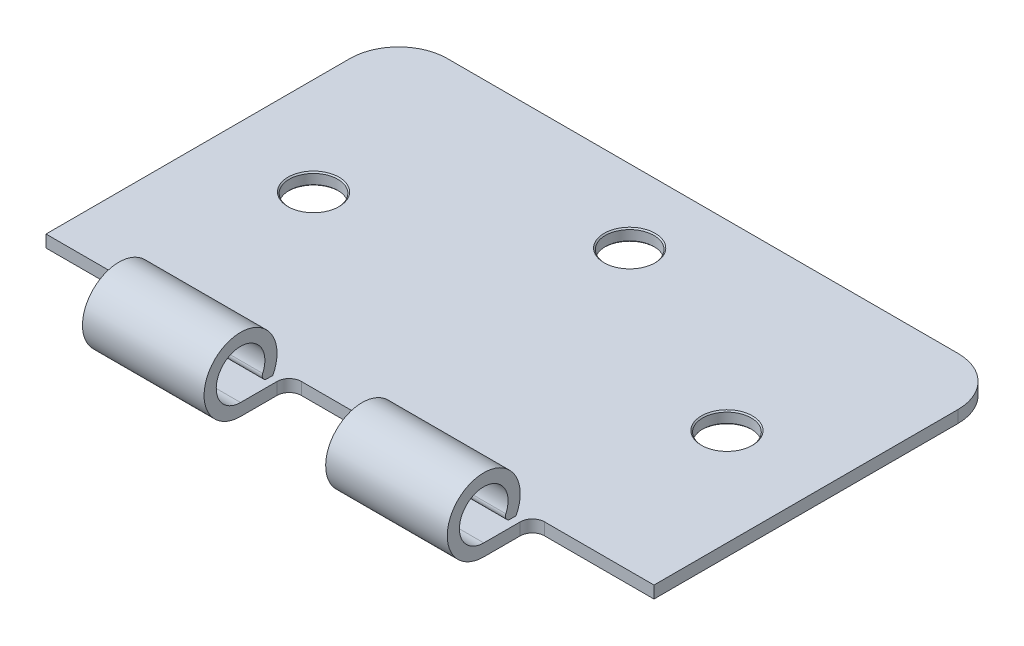
ISO-10303-21;
HEADER;
FILE_DESCRIPTION(('STEP AP214'),'2;1');
FILE_NAME('part.step','',(''),(''),'','','');
FILE_SCHEMA(('AUTOMOTIVE_DESIGN { 1 0 10303 214 1 1 1 1 }'));
ENDSEC;
DATA;
#1=APPLICATION_CONTEXT('core data for automotive mechanical design processes');
#2=APPLICATION_PROTOCOL_DEFINITION('international standard','automotive_design',2000,#1);
#3=PRODUCT_CONTEXT('',#1,'mechanical');
#4=PRODUCT('Part','Part','',(#3));
#5=PRODUCT_RELATED_PRODUCT_CATEGORY('part','',(#4));
#6=PRODUCT_DEFINITION_FORMATION('','',#4);
#7=PRODUCT_DEFINITION_CONTEXT('part definition',#1,'design');
#8=PRODUCT_DEFINITION('design','',#6,#7);
#9=PRODUCT_DEFINITION_SHAPE('','',#8);
#10=(LENGTH_UNIT() NAMED_UNIT(*) SI_UNIT(.MILLI.,.METRE.));
#11=(NAMED_UNIT(*) PLANE_ANGLE_UNIT() SI_UNIT($,.RADIAN.));
#12=(NAMED_UNIT(*) SI_UNIT($,.STERADIAN.) SOLID_ANGLE_UNIT());
#13=UNCERTAINTY_MEASURE_WITH_UNIT(LENGTH_MEASURE(1.E-05),#10,'distance_accuracy_value','');
#14=(GEOMETRIC_REPRESENTATION_CONTEXT(3) GLOBAL_UNCERTAINTY_ASSIGNED_CONTEXT((#13)) GLOBAL_UNIT_ASSIGNED_CONTEXT((#10,
#11,#12)) REPRESENTATION_CONTEXT('',''));
#15=CARTESIAN_POINT('',(0.,0.,0.));
#16=DIRECTION('',(0.,0.,1.));
#17=DIRECTION('',(1.,0.,0.));
#18=AXIS2_PLACEMENT_3D('',#15,#16,#17);
#19=CARTESIAN_POINT('',(-105.,5.,-130.));
#20=DIRECTION('',(0.,1.,0.));
#21=DIRECTION('',(0.,0.,1.));
#22=AXIS2_PLACEMENT_3D('',#19,#20,#21);
#23=PLANE('',#22);
#24=CARTESIAN_POINT('',(85.,5.,-75.));
#25=DIRECTION('',(0.,1.,0.));
#26=DIRECTION('',(0.,0.,1.));
#27=AXIS2_PLACEMENT_3D('',#24,#25,#26);
#28=CIRCLE('',#27,10.5);
#29=CARTESIAN_POINT('',(85.,5.,-64.5));
#30=VERTEX_POINT('',#29);
#31=EDGE_CURVE('E327',#30,#30,#28,.F.);
#32=ORIENTED_EDGE('',*,*,#31,.T.);
#33=EDGE_LOOP('',(#32));
#34=FACE_BOUND('',#33,.T.);
#35=CARTESIAN_POINT('',(0.,5.,-120.));
#36=DIRECTION('',(0.,1.,0.));
#37=DIRECTION('',(0.,0.,1.));
#38=AXIS2_PLACEMENT_3D('',#35,#36,#37);
#39=CIRCLE('',#38,10.5);
#40=CARTESIAN_POINT('',(0.,5.,-109.5));
#41=VERTEX_POINT('',#40);
#42=EDGE_CURVE('E324',#41,#41,#39,.F.);
#43=ORIENTED_EDGE('',*,*,#42,.T.);
#44=EDGE_LOOP('',(#43));
#45=FACE_BOUND('',#44,.T.);
#46=CARTESIAN_POINT('',(-85.,5.,-75.));
#47=DIRECTION('',(0.,1.,0.));
#48=DIRECTION('',(0.,0.,1.));
#49=AXIS2_PLACEMENT_3D('',#46,#47,#48);
#50=CIRCLE('',#49,10.5);
#51=CARTESIAN_POINT('',(-85.,5.,-64.5));
#52=VERTEX_POINT('',#51);
#53=EDGE_CURVE('E321',#52,#52,#50,.F.);
#54=ORIENTED_EDGE('',*,*,#53,.T.);
#55=EDGE_LOOP('',(#54));
#56=FACE_BOUND('',#55,.T.);
#57=DIRECTION('',(1.,0.,0.));
#58=VECTOR('',#57,1.);
#59=CARTESIAN_POINT('',(-105.,5.,-5.));
#60=LINE('',#59,#58);
#61=CARTESIAN_POINT('',(-125.,5.,-5.));
#62=VERTEX_POINT('',#61);
#63=CARTESIAN_POINT('',(-80.,5.,-5.00000000000001));
#64=VERTEX_POINT('',#63);
#65=EDGE_CURVE('E495',#62,#64,#60,.T.);
#66=ORIENTED_EDGE('',*,*,#65,.T.);
#67=CARTESIAN_POINT('',(-80.,5.,0.));
#68=DIRECTION('',(0.,1.,0.));
#69=DIRECTION('',(0.,0.,1.));
#70=AXIS2_PLACEMENT_3D('',#67,#68,#69);
#71=CIRCLE('',#70,5.);
#72=CARTESIAN_POINT('',(-75.,5.,0.));
#73=VERTEX_POINT('',#72);
#74=EDGE_CURVE('E294',#64,#73,#71,.F.);
#75=ORIENTED_EDGE('',*,*,#74,.T.);
#76=DIRECTION('',(0.,0.,1.));
#77=VECTOR('',#76,1.);
#78=CARTESIAN_POINT('',(-75.,5.,-130.));
#79=LINE('',#78,#77);
#80=CARTESIAN_POINT('',(-75.,5.,15.));
#81=VERTEX_POINT('',#80);
#82=EDGE_CURVE('E502',#73,#81,#79,.T.);
#83=ORIENTED_EDGE('',*,*,#82,.T.);
#84=DIRECTION('',(-1.,0.,0.));
#85=VECTOR('',#84,1.);
#86=CARTESIAN_POINT('',(125.,5.,15.));
#87=LINE('',#86,#85);
#88=CARTESIAN_POINT('',(-25.,5.,15.));
#89=VERTEX_POINT('',#88);
#90=EDGE_CURVE('E525',#89,#81,#87,.T.);
#91=ORIENTED_EDGE('',*,*,#90,.F.);
#92=DIRECTION('',(0.,0.,-1.));
#93=VECTOR('',#92,1.);
#94=CARTESIAN_POINT('',(-25.,5.,-130.));
#95=LINE('',#94,#93);
#96=CARTESIAN_POINT('',(-25.,5.,0.));
#97=VERTEX_POINT('',#96);
#98=EDGE_CURVE('E558',#89,#97,#95,.T.);
#99=ORIENTED_EDGE('',*,*,#98,.T.);
#100=CARTESIAN_POINT('',(-20.,5.,0.));
#101=DIRECTION('',(0.,1.,0.));
#102=DIRECTION('',(0.,0.,1.));
#103=AXIS2_PLACEMENT_3D('',#100,#101,#102);
#104=CIRCLE('',#103,5.);
#105=CARTESIAN_POINT('',(-20.,5.,-5.));
#106=VERTEX_POINT('',#105);
#107=EDGE_CURVE('E298',#97,#106,#104,.F.);
#108=ORIENTED_EDGE('',*,*,#107,.T.);
#109=DIRECTION('',(1.,0.,0.));
#110=VECTOR('',#109,1.);
#111=CARTESIAN_POINT('',(-105.,5.,-5.));
#112=LINE('',#111,#110);
#113=CARTESIAN_POINT('',(20.,5.,-5.));
#114=VERTEX_POINT('',#113);
#115=EDGE_CURVE('E211',#106,#114,#112,.T.);
#116=ORIENTED_EDGE('',*,*,#115,.T.);
#117=CARTESIAN_POINT('',(20.,5.,0.));
#118=DIRECTION('',(0.,1.,0.));
#119=DIRECTION('',(0.,0.,1.));
#120=AXIS2_PLACEMENT_3D('',#117,#118,#119);
#121=CIRCLE('',#120,5.);
#122=CARTESIAN_POINT('',(25.,5.,0.));
#123=VERTEX_POINT('',#122);
#124=EDGE_CURVE('E302',#114,#123,#121,.F.);
#125=ORIENTED_EDGE('',*,*,#124,.T.);
#126=DIRECTION('',(0.,0.,1.));
#127=VECTOR('',#126,1.);
#128=CARTESIAN_POINT('',(25.,5.,-130.));
#129=LINE('',#128,#127);
#130=CARTESIAN_POINT('',(25.,5.,15.));
#131=VERTEX_POINT('',#130);
#132=EDGE_CURVE('E553',#123,#131,#129,.T.);
#133=ORIENTED_EDGE('',*,*,#132,.T.);
#134=CARTESIAN_POINT('',(75.,5.,15.));
#135=VERTEX_POINT('',#134);
#136=EDGE_CURVE('E527',#135,#131,#87,.T.);
#137=ORIENTED_EDGE('',*,*,#136,.F.);
#138=DIRECTION('',(0.,0.,-1.));
#139=VECTOR('',#138,1.);
#140=CARTESIAN_POINT('',(75.,5.,-130.));
#141=LINE('',#140,#139);
#142=CARTESIAN_POINT('',(75.,5.,0.));
#143=VERTEX_POINT('',#142);
#144=EDGE_CURVE('E587',#135,#143,#141,.T.);
#145=ORIENTED_EDGE('',*,*,#144,.T.);
#146=CARTESIAN_POINT('',(80.,5.,0.));
#147=DIRECTION('',(0.,1.,0.));
#148=DIRECTION('',(0.,0.,1.));
#149=AXIS2_PLACEMENT_3D('',#146,#147,#148);
#150=CIRCLE('',#149,5.);
#151=CARTESIAN_POINT('',(80.,5.,-5.));
#152=VERTEX_POINT('',#151);
#153=EDGE_CURVE('E207',#143,#152,#150,.F.);
#154=ORIENTED_EDGE('',*,*,#153,.T.);
#155=DIRECTION('',(1.,0.,0.));
#156=VECTOR('',#155,1.);
#157=CARTESIAN_POINT('',(-105.,5.,-5.));
#158=LINE('',#157,#156);
#159=CARTESIAN_POINT('',(125.,5.,-5.));
#160=VERTEX_POINT('',#159);
#161=EDGE_CURVE('E200',#152,#160,#158,.T.);
#162=ORIENTED_EDGE('',*,*,#161,.T.);
#163=DIRECTION('',(0.,0.,-1.));
#164=VECTOR('',#163,1.);
#165=CARTESIAN_POINT('',(125.,5.,-130.));
#166=LINE('',#165,#164);
#167=CARTESIAN_POINT('',(125.,5.,-130.));
#168=VERTEX_POINT('',#167);
#169=EDGE_CURVE('E204',#160,#168,#166,.T.);
#170=ORIENTED_EDGE('',*,*,#169,.T.);
#171=CARTESIAN_POINT('',(105.,5.,-130.));
#172=DIRECTION('',(0.,1.,0.));
#173=DIRECTION('',(0.,0.,-1.));
#174=AXIS2_PLACEMENT_3D('',#171,#172,#173);
#175=CIRCLE('',#174,20.);
#176=CARTESIAN_POINT('',(105.,5.,-150.));
#177=VERTEX_POINT('',#176);
#178=EDGE_CURVE('E225',#168,#177,#175,.T.);
#179=ORIENTED_EDGE('',*,*,#178,.T.);
#180=DIRECTION('',(-1.,0.,0.));
#181=VECTOR('',#180,1.);
#182=CARTESIAN_POINT('',(-105.,5.,-150.));
#183=LINE('',#182,#181);
#184=CARTESIAN_POINT('',(-105.,5.,-150.));
#185=VERTEX_POINT('',#184);
#186=EDGE_CURVE('E228',#177,#185,#183,.T.);
#187=ORIENTED_EDGE('',*,*,#186,.T.);
#188=CARTESIAN_POINT('',(-105.,5.,-130.));
#189=DIRECTION('',(0.,1.,0.));
#190=DIRECTION('',(0.,0.,1.));
#191=AXIS2_PLACEMENT_3D('',#188,#189,#190);
#192=CIRCLE('',#191,20.);
#193=CARTESIAN_POINT('',(-125.,5.,-130.));
#194=VERTEX_POINT('',#193);
#195=EDGE_CURVE('E238',#185,#194,#192,.T.);
#196=ORIENTED_EDGE('',*,*,#195,.T.);
#197=DIRECTION('',(0.,0.,1.));
#198=VECTOR('',#197,1.);
#199=CARTESIAN_POINT('',(-125.,5.,-130.));
#200=LINE('',#199,#198);
#201=EDGE_CURVE('E240',#194,#62,#200,.T.);
#202=ORIENTED_EDGE('',*,*,#201,.T.);
#203=EDGE_LOOP('',(#66,#75,#83,#91,#99,#108,#116,#125,#133,#137,#145,#154,#162,#170,#179,#187,
#196,#202));
#204=FACE_BOUND('',#203,.T.);
#205=ADVANCED_FACE('F38',(#34,#45,#56,#204),#23,.T.);
#206=CARTESIAN_POINT('',(-105.,0.,-130.));
#207=DIRECTION('',(0.,1.,0.));
#208=DIRECTION('',(0.,0.,1.));
#209=AXIS2_PLACEMENT_3D('',#206,#207,#208);
#210=PLANE('',#209);
#211=CARTESIAN_POINT('',(85.,0.,-75.));
#212=DIRECTION('',(0.,1.,0.));
#213=DIRECTION('',(0.,0.,1.));
#214=AXIS2_PLACEMENT_3D('',#211,#212,#213);
#215=CIRCLE('',#214,10.5);
#216=CARTESIAN_POINT('',(85.,0.,-64.5));
#217=VERTEX_POINT('',#216);
#218=EDGE_CURVE('E312',#217,#217,#215,.T.);
#219=ORIENTED_EDGE('',*,*,#218,.T.);
#220=EDGE_LOOP('',(#219));
#221=FACE_BOUND('',#220,.T.);
#222=CARTESIAN_POINT('',(0.,0.,-120.));
#223=DIRECTION('',(0.,1.,0.));
#224=DIRECTION('',(0.,0.,1.));
#225=AXIS2_PLACEMENT_3D('',#222,#223,#224);
#226=CIRCLE('',#225,10.5);
#227=CARTESIAN_POINT('',(0.,0.,-109.5));
#228=VERTEX_POINT('',#227);
#229=EDGE_CURVE('E309',#228,#228,#226,.T.);
#230=ORIENTED_EDGE('',*,*,#229,.T.);
#231=EDGE_LOOP('',(#230));
#232=FACE_BOUND('',#231,.T.);
#233=CARTESIAN_POINT('',(-85.,0.,-75.));
#234=DIRECTION('',(0.,1.,0.));
#235=DIRECTION('',(0.,0.,1.));
#236=AXIS2_PLACEMENT_3D('',#233,#234,#235);
#237=CIRCLE('',#236,10.5);
#238=CARTESIAN_POINT('',(-85.,0.,-64.5));
#239=VERTEX_POINT('',#238);
#240=EDGE_CURVE('E306',#239,#239,#237,.T.);
#241=ORIENTED_EDGE('',*,*,#240,.T.);
#242=EDGE_LOOP('',(#241));
#243=FACE_BOUND('',#242,.T.);
#244=DIRECTION('',(0.,0.,1.));
#245=VECTOR('',#244,1.);
#246=CARTESIAN_POINT('',(-75.,0.,-130.));
#247=LINE('',#246,#245);
#248=CARTESIAN_POINT('',(-75.,0.,0.));
#249=VERTEX_POINT('',#248);
#250=CARTESIAN_POINT('',(-75.,0.,15.));
#251=VERTEX_POINT('',#250);
#252=EDGE_CURVE('E496',#249,#251,#247,.T.);
#253=ORIENTED_EDGE('',*,*,#252,.F.);
#254=CARTESIAN_POINT('',(-80.,0.,0.));
#255=DIRECTION('',(0.,1.,0.));
#256=DIRECTION('',(0.,0.,1.));
#257=AXIS2_PLACEMENT_3D('',#254,#255,#256);
#258=CIRCLE('',#257,5.);
#259=CARTESIAN_POINT('',(-80.,0.,-5.00000000000001));
#260=VERTEX_POINT('',#259);
#261=EDGE_CURVE('E292',#249,#260,#258,.T.);
#262=ORIENTED_EDGE('',*,*,#261,.T.);
#263=DIRECTION('',(1.,0.,0.));
#264=VECTOR('',#263,1.);
#265=CARTESIAN_POINT('',(-105.,0.,-5.));
#266=LINE('',#265,#264);
#267=CARTESIAN_POINT('',(-125.,0.,-5.));
#268=VERTEX_POINT('',#267);
#269=EDGE_CURVE('E491',#268,#260,#266,.T.);
#270=ORIENTED_EDGE('',*,*,#269,.F.);
#271=DIRECTION('',(0.,0.,1.));
#272=VECTOR('',#271,1.);
#273=CARTESIAN_POINT('',(-125.,0.,-130.));
#274=LINE('',#273,#272);
#275=CARTESIAN_POINT('',(-125.,0.,-130.));
#276=VERTEX_POINT('',#275);
#277=EDGE_CURVE('E226',#276,#268,#274,.T.);
#278=ORIENTED_EDGE('',*,*,#277,.F.);
#279=CARTESIAN_POINT('',(-105.,0.,-130.));
#280=DIRECTION('',(0.,1.,0.));
#281=DIRECTION('',(0.,0.,1.));
#282=AXIS2_PLACEMENT_3D('',#279,#280,#281);
#283=CIRCLE('',#282,20.);
#284=CARTESIAN_POINT('',(-105.,0.,-150.));
#285=VERTEX_POINT('',#284);
#286=EDGE_CURVE('E231',#285,#276,#283,.T.);
#287=ORIENTED_EDGE('',*,*,#286,.F.);
#288=DIRECTION('',(-1.,0.,0.));
#289=VECTOR('',#288,1.);
#290=CARTESIAN_POINT('',(-105.,0.,-150.));
#291=LINE('',#290,#289);
#292=CARTESIAN_POINT('',(105.,0.,-150.));
#293=VERTEX_POINT('',#292);
#294=EDGE_CURVE('E249',#293,#285,#291,.T.);
#295=ORIENTED_EDGE('',*,*,#294,.F.);
#296=CARTESIAN_POINT('',(105.,0.,-130.));
#297=DIRECTION('',(0.,1.,0.));
#298=DIRECTION('',(0.,0.,-1.));
#299=AXIS2_PLACEMENT_3D('',#296,#297,#298);
#300=CIRCLE('',#299,20.);
#301=CARTESIAN_POINT('',(125.,0.,-130.));
#302=VERTEX_POINT('',#301);
#303=EDGE_CURVE('E246',#302,#293,#300,.T.);
#304=ORIENTED_EDGE('',*,*,#303,.F.);
#305=DIRECTION('',(0.,0.,-1.));
#306=VECTOR('',#305,1.);
#307=CARTESIAN_POINT('',(125.,0.,-130.));
#308=LINE('',#307,#306);
#309=CARTESIAN_POINT('',(125.,0.,-5.));
#310=VERTEX_POINT('',#309);
#311=EDGE_CURVE('E244',#310,#302,#308,.T.);
#312=ORIENTED_EDGE('',*,*,#311,.F.);
#313=DIRECTION('',(1.,0.,0.));
#314=VECTOR('',#313,1.);
#315=CARTESIAN_POINT('',(-105.,0.,-5.));
#316=LINE('',#315,#314);
#317=CARTESIAN_POINT('',(80.,0.,-5.));
#318=VERTEX_POINT('',#317);
#319=EDGE_CURVE('E212',#318,#310,#316,.T.);
#320=ORIENTED_EDGE('',*,*,#319,.F.);
#321=CARTESIAN_POINT('',(80.,0.,0.));
#322=DIRECTION('',(0.,1.,0.));
#323=DIRECTION('',(0.,0.,1.));
#324=AXIS2_PLACEMENT_3D('',#321,#322,#323);
#325=CIRCLE('',#324,5.);
#326=CARTESIAN_POINT('',(75.,0.,0.));
#327=VERTEX_POINT('',#326);
#328=EDGE_CURVE('E62',#318,#327,#325,.T.);
#329=ORIENTED_EDGE('',*,*,#328,.T.);
#330=DIRECTION('',(0.,0.,-1.));
#331=VECTOR('',#330,1.);
#332=CARTESIAN_POINT('',(75.,0.,-130.));
#333=LINE('',#332,#331);
#334=CARTESIAN_POINT('',(75.,0.,15.));
#335=VERTEX_POINT('',#334);
#336=EDGE_CURVE('E541',#335,#327,#333,.T.);
#337=ORIENTED_EDGE('',*,*,#336,.F.);
#338=DIRECTION('',(-1.,0.,0.));
#339=VECTOR('',#338,1.);
#340=CARTESIAN_POINT('',(125.,0.,15.));
#341=LINE('',#340,#339);
#342=CARTESIAN_POINT('',(25.,0.,15.));
#343=VERTEX_POINT('',#342);
#344=EDGE_CURVE('E530',#335,#343,#341,.T.);
#345=ORIENTED_EDGE('',*,*,#344,.T.);
#346=DIRECTION('',(0.,0.,1.));
#347=VECTOR('',#346,1.);
#348=CARTESIAN_POINT('',(25.,0.,-130.));
#349=LINE('',#348,#347);
#350=CARTESIAN_POINT('',(25.,0.,0.));
#351=VERTEX_POINT('',#350);
#352=EDGE_CURVE('E540',#351,#343,#349,.T.);
#353=ORIENTED_EDGE('',*,*,#352,.F.);
#354=CARTESIAN_POINT('',(20.,0.,0.));
#355=DIRECTION('',(0.,1.,0.));
#356=DIRECTION('',(0.,0.,1.));
#357=AXIS2_PLACEMENT_3D('',#354,#355,#356);
#358=CIRCLE('',#357,5.);
#359=CARTESIAN_POINT('',(20.,0.,-5.));
#360=VERTEX_POINT('',#359);
#361=EDGE_CURVE('E300',#351,#360,#358,.T.);
#362=ORIENTED_EDGE('',*,*,#361,.T.);
#363=DIRECTION('',(1.,0.,0.));
#364=VECTOR('',#363,1.);
#365=CARTESIAN_POINT('',(-105.,0.,-5.));
#366=LINE('',#365,#364);
#367=CARTESIAN_POINT('',(-20.,0.,-5.));
#368=VERTEX_POINT('',#367);
#369=EDGE_CURVE('E271',#368,#360,#366,.T.);
#370=ORIENTED_EDGE('',*,*,#369,.F.);
#371=CARTESIAN_POINT('',(-20.,0.,0.));
#372=DIRECTION('',(0.,1.,0.));
#373=DIRECTION('',(0.,0.,1.));
#374=AXIS2_PLACEMENT_3D('',#371,#372,#373);
#375=CIRCLE('',#374,5.);
#376=CARTESIAN_POINT('',(-25.,0.,0.));
#377=VERTEX_POINT('',#376);
#378=EDGE_CURVE('E296',#368,#377,#375,.T.);
#379=ORIENTED_EDGE('',*,*,#378,.T.);
#380=DIRECTION('',(0.,0.,-1.));
#381=VECTOR('',#380,1.);
#382=CARTESIAN_POINT('',(-25.,0.,-130.));
#383=LINE('',#382,#381);
#384=CARTESIAN_POINT('',(-25.,0.,15.));
#385=VERTEX_POINT('',#384);
#386=EDGE_CURVE('E511',#385,#377,#383,.T.);
#387=ORIENTED_EDGE('',*,*,#386,.F.);
#388=EDGE_CURVE('E528',#385,#251,#341,.T.);
#389=ORIENTED_EDGE('',*,*,#388,.T.);
#390=EDGE_LOOP('',(#253,#262,#270,#278,#287,#295,#304,#312,#320,#329,#337,#345,#353,#362,#370,
#379,#387,#389));
#391=FACE_BOUND('',#390,.T.);
#392=ADVANCED_FACE('F350',(#221,#232,#243,#391),#210,.F.);
#393=CARTESIAN_POINT('',(125.,5.,-130.));
#394=DIRECTION('',(-1.,0.,0.));
#395=DIRECTION('',(0.,0.,1.));
#396=AXIS2_PLACEMENT_3D('',#393,#394,#395);
#397=PLANE('',#396);
#398=DIRECTION('',(0.,-1.,0.));
#399=VECTOR('',#398,1.);
#400=CARTESIAN_POINT('',(125.,30.,-5.));
#401=LINE('',#400,#399);
#402=EDGE_CURVE('E215',#160,#310,#401,.T.);
#403=ORIENTED_EDGE('',*,*,#402,.T.);
#404=ORIENTED_EDGE('',*,*,#311,.T.);
#405=DIRECTION('',(0.,-1.,0.));
#406=VECTOR('',#405,1.);
#407=CARTESIAN_POINT('',(125.,5.,-130.));
#408=LINE('',#407,#406);
#409=EDGE_CURVE('E224',#168,#302,#408,.T.);
#410=ORIENTED_EDGE('',*,*,#409,.F.);
#411=ORIENTED_EDGE('',*,*,#169,.F.);
#412=EDGE_LOOP('',(#403,#404,#410,#411));
#413=FACE_BOUND('',#412,.T.);
#414=ADVANCED_FACE('F222',(#413),#397,.F.);
#415=CARTESIAN_POINT('',(-125.,5.,-130.));
#416=DIRECTION('',(1.,0.,0.));
#417=DIRECTION('',(0.,0.,-1.));
#418=AXIS2_PLACEMENT_3D('',#415,#416,#417);
#419=PLANE('',#418);
#420=DIRECTION('',(0.,-1.,0.));
#421=VECTOR('',#420,1.);
#422=CARTESIAN_POINT('',(-125.,30.,-5.));
#423=LINE('',#422,#421);
#424=EDGE_CURVE('E219',#62,#268,#423,.T.);
#425=ORIENTED_EDGE('',*,*,#424,.F.);
#426=ORIENTED_EDGE('',*,*,#201,.F.);
#427=DIRECTION('',(0.,-1.,0.));
#428=VECTOR('',#427,1.);
#429=CARTESIAN_POINT('',(-125.,5.,-130.));
#430=LINE('',#429,#428);
#431=EDGE_CURVE('E243',#194,#276,#430,.T.);
#432=ORIENTED_EDGE('',*,*,#431,.T.);
#433=ORIENTED_EDGE('',*,*,#277,.T.);
#434=EDGE_LOOP('',(#425,#426,#432,#433));
#435=FACE_BOUND('',#434,.T.);
#436=ADVANCED_FACE('F362',(#435),#419,.F.);
#437=CARTESIAN_POINT('',(125.,10.,4.09128788536428));
#438=DIRECTION('',(-1.,0.,0.));
#439=DIRECTION('',(0.,0.,1.));
#440=AXIS2_PLACEMENT_3D('',#437,#438,#439);
#441=CYLINDRICAL_SURFACE('',#440,2.);
#442=CARTESIAN_POINT('',(-75.,10.,4.09128788536428));
#443=DIRECTION('',(-1.,0.,0.));
#444=DIRECTION('',(0.,0.,1.));
#445=AXIS2_PLACEMENT_3D('',#442,#443,#444);
#446=CIRCLE('',#445,2.);
#447=CARTESIAN_POINT('',(-75.,8.,4.09128788536428));
#448=VERTEX_POINT('',#447);
#449=CARTESIAN_POINT('',(-75.,10.8333333333333,5.9094065711369));
#450=VERTEX_POINT('',#449);
#451=EDGE_CURVE('E507',#448,#450,#446,.T.);
#452=ORIENTED_EDGE('',*,*,#451,.F.);
#453=DIRECTION('',(-1.,0.,0.));
#454=VECTOR('',#453,1.);
#455=CARTESIAN_POINT('',(125.,8.,4.09128788536428));
#456=LINE('',#455,#454);
#457=CARTESIAN_POINT('',(-25.,8.,4.09128788536428));
#458=VERTEX_POINT('',#457);
#459=EDGE_CURVE('E234',#458,#448,#456,.T.);
#460=ORIENTED_EDGE('',*,*,#459,.F.);
#461=CARTESIAN_POINT('',(-25.,10.,4.09128788536428));
#462=DIRECTION('',(1.,0.,0.));
#463=DIRECTION('',(0.,0.,-1.));
#464=AXIS2_PLACEMENT_3D('',#461,#462,#463);
#465=CIRCLE('',#464,2.);
#466=CARTESIAN_POINT('',(-25.,10.8333333333333,5.9094065711369));
#467=VERTEX_POINT('',#466);
#468=EDGE_CURVE('E551',#467,#458,#465,.T.);
#469=ORIENTED_EDGE('',*,*,#468,.F.);
#470=DIRECTION('',(-1.,0.,0.));
#471=VECTOR('',#470,1.);
#472=CARTESIAN_POINT('',(125.,10.8333333333333,5.9094065711369));
#473=LINE('',#472,#471);
#474=EDGE_CURVE('E521',#467,#450,#473,.T.);
#475=ORIENTED_EDGE('',*,*,#474,.T.);
#476=EDGE_LOOP('',(#452,#460,#469,#475));
#477=FACE_BOUND('',#476,.T.);
#478=ADVANCED_FACE('F365',(#477),#441,.T.);
#479=CARTESIAN_POINT('',(25.,10.,4.09128788536428));
#480=DIRECTION('',(-1.,0.,0.));
#481=DIRECTION('',(0.,0.,1.));
#482=AXIS2_PLACEMENT_3D('',#479,#480,#481);
#483=CIRCLE('',#482,2.);
#484=CARTESIAN_POINT('',(25.,8.,4.09128788536428));
#485=VERTEX_POINT('',#484);
#486=CARTESIAN_POINT('',(25.,10.8333333333333,5.9094065711369));
#487=VERTEX_POINT('',#486);
#488=EDGE_CURVE('E580',#485,#487,#483,.T.);
#489=ORIENTED_EDGE('',*,*,#488,.F.);
#490=CARTESIAN_POINT('',(75.,8.,4.09128788536428));
#491=VERTEX_POINT('',#490);
#492=EDGE_CURVE('E247',#491,#485,#456,.T.);
#493=ORIENTED_EDGE('',*,*,#492,.F.);
#494=CARTESIAN_POINT('',(75.,10.,4.09128788536428));
#495=DIRECTION('',(1.,0.,0.));
#496=DIRECTION('',(0.,0.,-1.));
#497=AXIS2_PLACEMENT_3D('',#494,#495,#496);
#498=CIRCLE('',#497,2.);
#499=CARTESIAN_POINT('',(75.,10.8333333333333,5.9094065711369));
#500=VERTEX_POINT('',#499);
#501=EDGE_CURVE('E589',#500,#491,#498,.T.);
#502=ORIENTED_EDGE('',*,*,#501,.F.);
#503=EDGE_CURVE('E524',#500,#487,#473,.T.);
#504=ORIENTED_EDGE('',*,*,#503,.T.);
#505=EDGE_LOOP('',(#489,#493,#502,#504));
#506=FACE_BOUND('',#505,.T.);
#507=ADVANCED_FACE('F451',(#506),#441,.T.);
#508=CARTESIAN_POINT('',(125.,8.,1.7335008385784));
#509=DIRECTION('',(0.,1.,0.));
#510=DIRECTION('',(0.,0.,1.));
#511=AXIS2_PLACEMENT_3D('',#508,#509,#510);
#512=PLANE('',#511);
#513=DIRECTION('',(0.,0.,1.));
#514=VECTOR('',#513,1.);
#515=CARTESIAN_POINT('',(-75.,8.,1.7335008385784));
#516=LINE('',#515,#514);
#517=CARTESIAN_POINT('',(-75.,8.,1.7335008385784));
#518=VERTEX_POINT('',#517);
#519=EDGE_CURVE('E506',#518,#448,#516,.T.);
#520=ORIENTED_EDGE('',*,*,#519,.F.);
#521=DIRECTION('',(-1.,0.,0.));
#522=VECTOR('',#521,1.);
#523=CARTESIAN_POINT('',(125.,8.,1.7335008385784));
#524=LINE('',#523,#522);
#525=CARTESIAN_POINT('',(-25.,8.,1.7335008385784));
#526=VERTEX_POINT('',#525);
#527=EDGE_CURVE('E531',#526,#518,#524,.T.);
#528=ORIENTED_EDGE('',*,*,#527,.F.);
#529=DIRECTION('',(0.,0.,-1.));
#530=VECTOR('',#529,1.);
#531=CARTESIAN_POINT('',(-25.,8.,1.73350083857839));
#532=LINE('',#531,#530);
#533=EDGE_CURVE('E561',#458,#526,#532,.T.);
#534=ORIENTED_EDGE('',*,*,#533,.F.);
#535=ORIENTED_EDGE('',*,*,#459,.T.);
#536=EDGE_LOOP('',(#520,#528,#534,#535));
#537=FACE_BOUND('',#536,.T.);
#538=ADVANCED_FACE('F453',(#537),#512,.F.);
#539=DIRECTION('',(0.,0.,1.));
#540=VECTOR('',#539,1.);
#541=CARTESIAN_POINT('',(25.,8.,1.73350083857839));
#542=LINE('',#541,#540);
#543=CARTESIAN_POINT('',(25.,8.,1.7335008385784));
#544=VERTEX_POINT('',#543);
#545=EDGE_CURVE('E549',#544,#485,#542,.T.);
#546=ORIENTED_EDGE('',*,*,#545,.F.);
#547=CARTESIAN_POINT('',(75.,8.,1.7335008385784));
#548=VERTEX_POINT('',#547);
#549=EDGE_CURVE('E533',#548,#544,#524,.T.);
#550=ORIENTED_EDGE('',*,*,#549,.F.);
#551=DIRECTION('',(0.,0.,-1.));
#552=VECTOR('',#551,1.);
#553=CARTESIAN_POINT('',(75.,8.,1.7335008385784));
#554=LINE('',#553,#552);
#555=EDGE_CURVE('E585',#491,#548,#554,.T.);
#556=ORIENTED_EDGE('',*,*,#555,.F.);
#557=ORIENTED_EDGE('',*,*,#492,.T.);
#558=EDGE_LOOP('',(#546,#550,#556,#557));
#559=FACE_BOUND('',#558,.T.);
#560=ADVANCED_FACE('F456',(#559),#512,.F.);
#561=CARTESIAN_POINT('',(125.,15.,15.));
#562=DIRECTION('',(-1.,0.,0.));
#563=DIRECTION('',(0.,0.,1.));
#564=AXIS2_PLACEMENT_3D('',#561,#562,#563);
#565=CYLINDRICAL_SURFACE('',#564,15.);
#566=ORIENTED_EDGE('',*,*,#527,.T.);
#567=CARTESIAN_POINT('',(-75.,15.,15.));
#568=DIRECTION('',(-1.,0.,0.));
#569=DIRECTION('',(0.,0.,1.));
#570=AXIS2_PLACEMENT_3D('',#567,#568,#569);
#571=CIRCLE('',#570,15.);
#572=EDGE_CURVE('E509',#251,#518,#571,.T.);
#573=ORIENTED_EDGE('',*,*,#572,.F.);
#574=ORIENTED_EDGE('',*,*,#388,.F.);
#575=CARTESIAN_POINT('',(-25.,15.,15.));
#576=DIRECTION('',(1.,0.,0.));
#577=DIRECTION('',(0.,0.,-1.));
#578=AXIS2_PLACEMENT_3D('',#575,#576,#577);
#579=CIRCLE('',#578,15.);
#580=EDGE_CURVE('E564',#526,#385,#579,.T.);
#581=ORIENTED_EDGE('',*,*,#580,.F.);
#582=EDGE_LOOP('',(#566,#573,#574,#581));
#583=FACE_BOUND('',#582,.T.);
#584=ADVANCED_FACE('F458',(#583),#565,.T.);
#585=ORIENTED_EDGE('',*,*,#549,.T.);
#586=CARTESIAN_POINT('',(25.,15.,15.));
#587=DIRECTION('',(-1.,0.,0.));
#588=DIRECTION('',(0.,0.,1.));
#589=AXIS2_PLACEMENT_3D('',#586,#587,#588);
#590=CIRCLE('',#589,15.);
#591=EDGE_CURVE('E546',#343,#544,#590,.T.);
#592=ORIENTED_EDGE('',*,*,#591,.F.);
#593=ORIENTED_EDGE('',*,*,#344,.F.);
#594=CARTESIAN_POINT('',(75.,15.,15.));
#595=DIRECTION('',(1.,0.,0.));
#596=DIRECTION('',(0.,0.,-1.));
#597=AXIS2_PLACEMENT_3D('',#594,#595,#596);
#598=CIRCLE('',#597,15.);
#599=EDGE_CURVE('E544',#548,#335,#598,.T.);
#600=ORIENTED_EDGE('',*,*,#599,.F.);
#601=EDGE_LOOP('',(#585,#592,#593,#600));
#602=FACE_BOUND('',#601,.T.);
#603=ADVANCED_FACE('F461',(#602),#565,.T.);
#604=CARTESIAN_POINT('',(125.,15.,15.));
#605=DIRECTION('',(-1.,0.,0.));
#606=DIRECTION('',(0.,0.,1.));
#607=AXIS2_PLACEMENT_3D('',#604,#605,#606);
#608=CYLINDRICAL_SURFACE('',#607,10.);
#609=CARTESIAN_POINT('',(-75.,15.,15.));
#610=DIRECTION('',(-1.,0.,0.));
#611=DIRECTION('',(0.,0.,1.));
#612=AXIS2_PLACEMENT_3D('',#609,#610,#611);
#613=CIRCLE('',#612,10.);
#614=EDGE_CURVE('E268',#450,#81,#613,.F.);
#615=ORIENTED_EDGE('',*,*,#614,.F.);
#616=ORIENTED_EDGE('',*,*,#474,.F.);
#617=CARTESIAN_POINT('',(-25.,15.,15.));
#618=DIRECTION('',(1.,0.,0.));
#619=DIRECTION('',(0.,0.,-1.));
#620=AXIS2_PLACEMENT_3D('',#617,#618,#619);
#621=CIRCLE('',#620,10.);
#622=EDGE_CURVE('E266',#89,#467,#621,.F.);
#623=ORIENTED_EDGE('',*,*,#622,.F.);
#624=ORIENTED_EDGE('',*,*,#90,.T.);
#625=EDGE_LOOP('',(#615,#616,#623,#624));
#626=FACE_BOUND('',#625,.T.);
#627=ADVANCED_FACE('F463',(#626),#608,.F.);
#628=CARTESIAN_POINT('',(25.,15.,15.));
#629=DIRECTION('',(-1.,0.,0.));
#630=DIRECTION('',(0.,0.,1.));
#631=AXIS2_PLACEMENT_3D('',#628,#629,#630);
#632=CIRCLE('',#631,10.);
#633=EDGE_CURVE('E263',#487,#131,#632,.F.);
#634=ORIENTED_EDGE('',*,*,#633,.F.);
#635=ORIENTED_EDGE('',*,*,#503,.F.);
#636=CARTESIAN_POINT('',(75.,15.,15.));
#637=DIRECTION('',(1.,0.,0.));
#638=DIRECTION('',(0.,0.,-1.));
#639=AXIS2_PLACEMENT_3D('',#636,#637,#638);
#640=CIRCLE('',#639,10.);
#641=EDGE_CURVE('E261',#135,#500,#640,.F.);
#642=ORIENTED_EDGE('',*,*,#641,.F.);
#643=ORIENTED_EDGE('',*,*,#136,.T.);
#644=EDGE_LOOP('',(#634,#635,#642,#643));
#645=FACE_BOUND('',#644,.T.);
#646=ADVANCED_FACE('F378',(#645),#608,.F.);
#647=CARTESIAN_POINT('',(105.,5.,-130.));
#648=DIRECTION('',(0.,-1.,0.));
#649=DIRECTION('',(0.,0.,-1.));
#650=AXIS2_PLACEMENT_3D('',#647,#648,#649);
#651=CYLINDRICAL_SURFACE('',#650,20.);
#652=ORIENTED_EDGE('',*,*,#303,.T.);
#653=DIRECTION('',(0.,-1.,0.));
#654=VECTOR('',#653,1.);
#655=CARTESIAN_POINT('',(105.,5.,-150.));
#656=LINE('',#655,#654);
#657=EDGE_CURVE('E257',#177,#293,#656,.T.);
#658=ORIENTED_EDGE('',*,*,#657,.F.);
#659=ORIENTED_EDGE('',*,*,#178,.F.);
#660=ORIENTED_EDGE('',*,*,#409,.T.);
#661=EDGE_LOOP('',(#652,#658,#659,#660));
#662=FACE_BOUND('',#661,.T.);
#663=ADVANCED_FACE('F374',(#662),#651,.T.);
#664=CARTESIAN_POINT('',(-105.,5.,-150.));
#665=DIRECTION('',(0.,0.,1.));
#666=DIRECTION('',(1.,0.,0.));
#667=AXIS2_PLACEMENT_3D('',#664,#665,#666);
#668=PLANE('',#667);
#669=ORIENTED_EDGE('',*,*,#294,.T.);
#670=DIRECTION('',(0.,-1.,0.));
#671=VECTOR('',#670,1.);
#672=CARTESIAN_POINT('',(-105.,5.,-150.));
#673=LINE('',#672,#671);
#674=EDGE_CURVE('E254',#185,#285,#673,.T.);
#675=ORIENTED_EDGE('',*,*,#674,.F.);
#676=ORIENTED_EDGE('',*,*,#186,.F.);
#677=ORIENTED_EDGE('',*,*,#657,.T.);
#678=EDGE_LOOP('',(#669,#675,#676,#677));
#679=FACE_BOUND('',#678,.T.);
#680=ADVANCED_FACE('F370',(#679),#668,.F.);
#681=CARTESIAN_POINT('',(-105.,5.,-130.));
#682=DIRECTION('',(0.,-1.,0.));
#683=DIRECTION('',(0.,0.,-1.));
#684=AXIS2_PLACEMENT_3D('',#681,#682,#683);
#685=CYLINDRICAL_SURFACE('',#684,20.);
#686=ORIENTED_EDGE('',*,*,#286,.T.);
#687=ORIENTED_EDGE('',*,*,#431,.F.);
#688=ORIENTED_EDGE('',*,*,#195,.F.);
#689=ORIENTED_EDGE('',*,*,#674,.T.);
#690=EDGE_LOOP('',(#686,#687,#688,#689));
#691=FACE_BOUND('',#690,.T.);
#692=ADVANCED_FACE('F367',(#691),#685,.T.);
#693=CARTESIAN_POINT('',(-85.,5.,-75.));
#694=DIRECTION('',(0.,-1.,0.));
#695=DIRECTION('',(0.,0.,-1.));
#696=AXIS2_PLACEMENT_3D('',#693,#694,#695);
#697=CYLINDRICAL_SURFACE('',#696,9.99999999999999);
#698=CARTESIAN_POINT('',(-85.,0.500000000000051,-75.));
#699=DIRECTION('',(0.,1.,0.));
#700=DIRECTION('',(0.,0.,1.));
#701=AXIS2_PLACEMENT_3D('',#698,#699,#700);
#702=CIRCLE('',#701,9.99999999999999);
#703=CARTESIAN_POINT('',(-85.,0.500000000000051,-65.));
#704=VERTEX_POINT('',#703);
#705=EDGE_CURVE('E11',#704,#704,#702,.F.);
#706=ORIENTED_EDGE('',*,*,#705,.T.);
#707=EDGE_LOOP('',(#706));
#708=FACE_BOUND('',#707,.T.);
#709=CARTESIAN_POINT('',(-85.,4.49999999999998,-75.));
#710=DIRECTION('',(0.,1.,0.));
#711=DIRECTION('',(0.,0.,1.));
#712=AXIS2_PLACEMENT_3D('',#709,#710,#711);
#713=CIRCLE('',#712,9.99999999999999);
#714=CARTESIAN_POINT('',(-85.,4.49999999999998,-65.));
#715=VERTEX_POINT('',#714);
#716=EDGE_CURVE('E47',#715,#715,#713,.T.);
#717=ORIENTED_EDGE('',*,*,#716,.T.);
#718=EDGE_LOOP('',(#717));
#719=FACE_BOUND('',#718,.T.);
#720=ADVANCED_FACE('F338',(#708,#719),#697,.F.);
#721=CARTESIAN_POINT('',(85.,5.,-75.));
#722=DIRECTION('',(0.,-1.,0.));
#723=DIRECTION('',(0.,0.,-1.));
#724=AXIS2_PLACEMENT_3D('',#721,#722,#723);
#725=CYLINDRICAL_SURFACE('',#724,9.99999999999999);
#726=CARTESIAN_POINT('',(85.,0.500000000000051,-75.));
#727=DIRECTION('',(0.,1.,0.));
#728=DIRECTION('',(0.,0.,1.));
#729=AXIS2_PLACEMENT_3D('',#726,#727,#728);
#730=CIRCLE('',#729,9.99999999999999);
#731=CARTESIAN_POINT('',(85.,0.500000000000051,-65.));
#732=VERTEX_POINT('',#731);
#733=EDGE_CURVE('E318',#732,#732,#730,.F.);
#734=ORIENTED_EDGE('',*,*,#733,.T.);
#735=EDGE_LOOP('',(#734));
#736=FACE_BOUND('',#735,.T.);
#737=CARTESIAN_POINT('',(85.,4.49999999999998,-75.));
#738=DIRECTION('',(0.,1.,0.));
#739=DIRECTION('',(0.,0.,1.));
#740=AXIS2_PLACEMENT_3D('',#737,#738,#739);
#741=CIRCLE('',#740,9.99999999999999);
#742=CARTESIAN_POINT('',(85.,4.49999999999998,-65.));
#743=VERTEX_POINT('',#742);
#744=EDGE_CURVE('E315',#743,#743,#741,.T.);
#745=ORIENTED_EDGE('',*,*,#744,.T.);
#746=EDGE_LOOP('',(#745));
#747=FACE_BOUND('',#746,.T.);
#748=ADVANCED_FACE('F438',(#736,#747),#725,.F.);
#749=CARTESIAN_POINT('',(0.,5.,-120.));
#750=DIRECTION('',(0.,-1.,0.));
#751=DIRECTION('',(0.,0.,-1.));
#752=AXIS2_PLACEMENT_3D('',#749,#750,#751);
#753=CYLINDRICAL_SURFACE('',#752,10.);
#754=CARTESIAN_POINT('',(0.,0.500000000000044,-120.));
#755=DIRECTION('',(0.,1.,0.));
#756=DIRECTION('',(0.,0.,1.));
#757=AXIS2_PLACEMENT_3D('',#754,#755,#756);
#758=CIRCLE('',#757,10.);
#759=CARTESIAN_POINT('',(0.,0.500000000000044,-110.));
#760=VERTEX_POINT('',#759);
#761=EDGE_CURVE('E333',#760,#760,#758,.F.);
#762=ORIENTED_EDGE('',*,*,#761,.T.);
#763=EDGE_LOOP('',(#762));
#764=FACE_BOUND('',#763,.T.);
#765=CARTESIAN_POINT('',(0.,4.49999999999998,-120.));
#766=DIRECTION('',(0.,1.,0.));
#767=DIRECTION('',(0.,0.,1.));
#768=AXIS2_PLACEMENT_3D('',#765,#766,#767);
#769=CIRCLE('',#768,10.);
#770=CARTESIAN_POINT('',(0.,4.49999999999998,-110.));
#771=VERTEX_POINT('',#770);
#772=EDGE_CURVE('E330',#771,#771,#769,.T.);
#773=ORIENTED_EDGE('',*,*,#772,.T.);
#774=EDGE_LOOP('',(#773));
#775=FACE_BOUND('',#774,.T.);
#776=ADVANCED_FACE('F436',(#764,#775),#753,.F.);
#777=CARTESIAN_POINT('',(75.,30.,-5.));
#778=DIRECTION('',(0.,0.,1.));
#779=DIRECTION('',(1.,0.,0.));
#780=AXIS2_PLACEMENT_3D('',#777,#778,#779);
#781=PLANE('',#780);
#782=ORIENTED_EDGE('',*,*,#161,.F.);
#783=DIRECTION('',(0.,-1.,0.));
#784=VECTOR('',#783,1.);
#785=CARTESIAN_POINT('',(80.,0.,-5.));
#786=LINE('',#785,#784);
#787=EDGE_CURVE('E289',#152,#318,#786,.T.);
#788=ORIENTED_EDGE('',*,*,#787,.T.);
#789=ORIENTED_EDGE('',*,*,#319,.T.);
#790=ORIENTED_EDGE('',*,*,#402,.F.);
#791=EDGE_LOOP('',(#782,#788,#789,#790));
#792=FACE_BOUND('',#791,.T.);
#793=ADVANCED_FACE('F216',(#792),#781,.T.);
#794=CARTESIAN_POINT('',(75.,30.,30.));
#795=DIRECTION('',(1.,0.,0.));
#796=DIRECTION('',(0.,0.,-1.));
#797=AXIS2_PLACEMENT_3D('',#794,#795,#796);
#798=PLANE('',#797);
#799=ORIENTED_EDGE('',*,*,#336,.T.);
#800=DIRECTION('',(0.,-1.,0.));
#801=VECTOR('',#800,1.);
#802=CARTESIAN_POINT('',(75.,5.,0.));
#803=LINE('',#802,#801);
#804=EDGE_CURVE('E54',#327,#143,#803,.F.);
#805=ORIENTED_EDGE('',*,*,#804,.T.);
#806=ORIENTED_EDGE('',*,*,#144,.F.);
#807=ORIENTED_EDGE('',*,*,#641,.T.);
#808=ORIENTED_EDGE('',*,*,#501,.T.);
#809=ORIENTED_EDGE('',*,*,#555,.T.);
#810=ORIENTED_EDGE('',*,*,#599,.T.);
#811=EDGE_LOOP('',(#799,#805,#806,#807,#808,#809,#810));
#812=FACE_BOUND('',#811,.T.);
#813=ADVANCED_FACE('F445',(#812),#798,.T.);
#814=CARTESIAN_POINT('',(-25.,30.,-5.));
#815=DIRECTION('',(0.,0.,1.));
#816=DIRECTION('',(1.,0.,0.));
#817=AXIS2_PLACEMENT_3D('',#814,#815,#816);
#818=PLANE('',#817);
#819=ORIENTED_EDGE('',*,*,#115,.F.);
#820=DIRECTION('',(0.,-1.,0.));
#821=VECTOR('',#820,1.);
#822=CARTESIAN_POINT('',(-20.,0.,-5.));
#823=LINE('',#822,#821);
#824=EDGE_CURVE('E281',#106,#368,#823,.T.);
#825=ORIENTED_EDGE('',*,*,#824,.T.);
#826=ORIENTED_EDGE('',*,*,#369,.T.);
#827=DIRECTION('',(0.,-1.,0.));
#828=VECTOR('',#827,1.);
#829=CARTESIAN_POINT('',(20.,5.,-5.));
#830=LINE('',#829,#828);
#831=EDGE_CURVE('E279',#360,#114,#830,.F.);
#832=ORIENTED_EDGE('',*,*,#831,.T.);
#833=EDGE_LOOP('',(#819,#825,#826,#832));
#834=FACE_BOUND('',#833,.T.);
#835=ADVANCED_FACE('F468',(#834),#818,.T.);
#836=CARTESIAN_POINT('',(-25.,30.,30.));
#837=DIRECTION('',(1.,0.,0.));
#838=DIRECTION('',(0.,0.,-1.));
#839=AXIS2_PLACEMENT_3D('',#836,#837,#838);
#840=PLANE('',#839);
#841=ORIENTED_EDGE('',*,*,#386,.T.);
#842=DIRECTION('',(0.,-1.,0.));
#843=VECTOR('',#842,1.);
#844=CARTESIAN_POINT('',(-25.,5.,0.));
#845=LINE('',#844,#843);
#846=EDGE_CURVE('E284',#377,#97,#845,.F.);
#847=ORIENTED_EDGE('',*,*,#846,.T.);
#848=ORIENTED_EDGE('',*,*,#98,.F.);
#849=ORIENTED_EDGE('',*,*,#622,.T.);
#850=ORIENTED_EDGE('',*,*,#468,.T.);
#851=ORIENTED_EDGE('',*,*,#533,.T.);
#852=ORIENTED_EDGE('',*,*,#580,.T.);
#853=EDGE_LOOP('',(#841,#847,#848,#849,#850,#851,#852));
#854=FACE_BOUND('',#853,.T.);
#855=ADVANCED_FACE('F470',(#854),#840,.T.);
#856=CARTESIAN_POINT('',(25.,30.,30.));
#857=DIRECTION('',(-1.,0.,0.));
#858=DIRECTION('',(0.,0.,1.));
#859=AXIS2_PLACEMENT_3D('',#856,#857,#858);
#860=PLANE('',#859);
#861=ORIENTED_EDGE('',*,*,#132,.F.);
#862=DIRECTION('',(0.,-1.,0.));
#863=VECTOR('',#862,1.);
#864=CARTESIAN_POINT('',(25.,0.,0.));
#865=LINE('',#864,#863);
#866=EDGE_CURVE('E286',#123,#351,#865,.T.);
#867=ORIENTED_EDGE('',*,*,#866,.T.);
#868=ORIENTED_EDGE('',*,*,#352,.T.);
#869=ORIENTED_EDGE('',*,*,#591,.T.);
#870=ORIENTED_EDGE('',*,*,#545,.T.);
#871=ORIENTED_EDGE('',*,*,#488,.T.);
#872=ORIENTED_EDGE('',*,*,#633,.T.);
#873=EDGE_LOOP('',(#861,#867,#868,#869,#870,#871,#872));
#874=FACE_BOUND('',#873,.T.);
#875=ADVANCED_FACE('F473',(#874),#860,.T.);
#876=CARTESIAN_POINT('',(-75.,30.,-5.));
#877=DIRECTION('',(0.,0.,1.));
#878=DIRECTION('',(1.,0.,0.));
#879=AXIS2_PLACEMENT_3D('',#876,#877,#878);
#880=PLANE('',#879);
#881=ORIENTED_EDGE('',*,*,#269,.T.);
#882=DIRECTION('',(0.,-1.,0.));
#883=VECTOR('',#882,1.);
#884=CARTESIAN_POINT('',(-80.,5.,-5.));
#885=LINE('',#884,#883);
#886=EDGE_CURVE('E277',#260,#64,#885,.F.);
#887=ORIENTED_EDGE('',*,*,#886,.T.);
#888=ORIENTED_EDGE('',*,*,#65,.F.);
#889=ORIENTED_EDGE('',*,*,#424,.T.);
#890=EDGE_LOOP('',(#881,#887,#888,#889));
#891=FACE_BOUND('',#890,.T.);
#892=ADVANCED_FACE('F477',(#891),#880,.T.);
#893=CARTESIAN_POINT('',(-75.,30.,-5.));
#894=DIRECTION('',(-1.,0.,0.));
#895=DIRECTION('',(0.,0.,1.));
#896=AXIS2_PLACEMENT_3D('',#893,#894,#895);
#897=PLANE('',#896);
#898=ORIENTED_EDGE('',*,*,#82,.F.);
#899=DIRECTION('',(0.,-1.,0.));
#900=VECTOR('',#899,1.);
#901=CARTESIAN_POINT('',(-75.,0.,0.));
#902=LINE('',#901,#900);
#903=EDGE_CURVE('E274',#73,#249,#902,.T.);
#904=ORIENTED_EDGE('',*,*,#903,.T.);
#905=ORIENTED_EDGE('',*,*,#252,.T.);
#906=ORIENTED_EDGE('',*,*,#572,.T.);
#907=ORIENTED_EDGE('',*,*,#519,.T.);
#908=ORIENTED_EDGE('',*,*,#451,.T.);
#909=ORIENTED_EDGE('',*,*,#614,.T.);
#910=EDGE_LOOP('',(#898,#904,#905,#906,#907,#908,#909));
#911=FACE_BOUND('',#910,.T.);
#912=ADVANCED_FACE('F386',(#911),#897,.T.);
#913=CARTESIAN_POINT('',(-80.,30.,0.));
#914=DIRECTION('',(0.,1.,0.));
#915=DIRECTION('',(0.,0.,1.));
#916=AXIS2_PLACEMENT_3D('',#913,#914,#915);
#917=CYLINDRICAL_SURFACE('',#916,5.);
#918=ORIENTED_EDGE('',*,*,#74,.F.);
#919=ORIENTED_EDGE('',*,*,#886,.F.);
#920=ORIENTED_EDGE('',*,*,#261,.F.);
#921=ORIENTED_EDGE('',*,*,#903,.F.);
#922=EDGE_LOOP('',(#918,#919,#920,#921));
#923=FACE_BOUND('',#922,.T.);
#924=ADVANCED_FACE('F382',(#923),#917,.F.);
#925=CARTESIAN_POINT('',(-20.,30.,0.));
#926=DIRECTION('',(0.,1.,0.));
#927=DIRECTION('',(0.,0.,1.));
#928=AXIS2_PLACEMENT_3D('',#925,#926,#927);
#929=CYLINDRICAL_SURFACE('',#928,5.);
#930=ORIENTED_EDGE('',*,*,#107,.F.);
#931=ORIENTED_EDGE('',*,*,#846,.F.);
#932=ORIENTED_EDGE('',*,*,#378,.F.);
#933=ORIENTED_EDGE('',*,*,#824,.F.);
#934=EDGE_LOOP('',(#930,#931,#932,#933));
#935=FACE_BOUND('',#934,.T.);
#936=ADVANCED_FACE('F385',(#935),#929,.F.);
#937=CARTESIAN_POINT('',(20.,30.,0.));
#938=DIRECTION('',(0.,1.,0.));
#939=DIRECTION('',(0.,0.,1.));
#940=AXIS2_PLACEMENT_3D('',#937,#938,#939);
#941=CYLINDRICAL_SURFACE('',#940,5.);
#942=ORIENTED_EDGE('',*,*,#124,.F.);
#943=ORIENTED_EDGE('',*,*,#831,.F.);
#944=ORIENTED_EDGE('',*,*,#361,.F.);
#945=ORIENTED_EDGE('',*,*,#866,.F.);
#946=EDGE_LOOP('',(#942,#943,#944,#945));
#947=FACE_BOUND('',#946,.T.);
#948=ADVANCED_FACE('F390',(#947),#941,.F.);
#949=CARTESIAN_POINT('',(80.,30.,0.));
#950=DIRECTION('',(0.,1.,0.));
#951=DIRECTION('',(0.,0.,1.));
#952=AXIS2_PLACEMENT_3D('',#949,#950,#951);
#953=CYLINDRICAL_SURFACE('',#952,5.);
#954=ORIENTED_EDGE('',*,*,#153,.F.);
#955=ORIENTED_EDGE('',*,*,#804,.F.);
#956=ORIENTED_EDGE('',*,*,#328,.F.);
#957=ORIENTED_EDGE('',*,*,#787,.F.);
#958=EDGE_LOOP('',(#954,#955,#956,#957));
#959=FACE_BOUND('',#958,.T.);
#960=ADVANCED_FACE('F394',(#959),#953,.F.);
#961=CARTESIAN_POINT('',(85.,0.,-75.));
#962=DIRECTION('',(0.,-1.,0.));
#963=DIRECTION('',(0.,0.,-1.));
#964=AXIS2_PLACEMENT_3D('',#961,#962,#963);
#965=CONICAL_SURFACE('',#964,10.5,0.785398163397441);
#966=ORIENTED_EDGE('',*,*,#733,.F.);
#967=EDGE_LOOP('',(#966));
#968=FACE_BOUND('',#967,.T.);
#969=ORIENTED_EDGE('',*,*,#218,.F.);
#970=EDGE_LOOP('',(#969));
#971=FACE_BOUND('',#970,.T.);
#972=ADVANCED_FACE('F398',(#968,#971),#965,.F.);
#973=CARTESIAN_POINT('',(85.,4.49999999999998,-75.));
#974=DIRECTION('',(0.,1.,0.));
#975=DIRECTION('',(0.,0.,1.));
#976=AXIS2_PLACEMENT_3D('',#973,#974,#975);
#977=CONICAL_SURFACE('',#976,9.99999999999999,0.785398163397469);
#978=ORIENTED_EDGE('',*,*,#31,.F.);
#979=EDGE_LOOP('',(#978));
#980=FACE_BOUND('',#979,.T.);
#981=ORIENTED_EDGE('',*,*,#744,.F.);
#982=EDGE_LOOP('',(#981));
#983=FACE_BOUND('',#982,.T.);
#984=ADVANCED_FACE('F406',(#980,#983),#977,.F.);
#985=CARTESIAN_POINT('',(0.,0.,-120.));
#986=DIRECTION('',(0.,-1.,0.));
#987=DIRECTION('',(0.,0.,-1.));
#988=AXIS2_PLACEMENT_3D('',#985,#986,#987);
#989=CONICAL_SURFACE('',#988,10.5,0.785398163397441);
#990=ORIENTED_EDGE('',*,*,#761,.F.);
#991=EDGE_LOOP('',(#990));
#992=FACE_BOUND('',#991,.T.);
#993=ORIENTED_EDGE('',*,*,#229,.F.);
#994=EDGE_LOOP('',(#993));
#995=FACE_BOUND('',#994,.T.);
#996=ADVANCED_FACE('F413',(#992,#995),#989,.F.);
#997=CARTESIAN_POINT('',(0.,4.49999999999998,-120.));
#998=DIRECTION('',(0.,1.,0.));
#999=DIRECTION('',(0.,0.,1.));
#1000=AXIS2_PLACEMENT_3D('',#997,#998,#999);
#1001=CONICAL_SURFACE('',#1000,10.,0.785398163397469);
#1002=ORIENTED_EDGE('',*,*,#42,.F.);
#1003=EDGE_LOOP('',(#1002));
#1004=FACE_BOUND('',#1003,.T.);
#1005=ORIENTED_EDGE('',*,*,#772,.F.);
#1006=EDGE_LOOP('',(#1005));
#1007=FACE_BOUND('',#1006,.T.);
#1008=ADVANCED_FACE('F346',(#1004,#1007),#1001,.F.);
#1009=CARTESIAN_POINT('',(-85.,0.,-75.));
#1010=DIRECTION('',(0.,-1.,0.));
#1011=DIRECTION('',(0.,0.,-1.));
#1012=AXIS2_PLACEMENT_3D('',#1009,#1010,#1011);
#1013=CONICAL_SURFACE('',#1012,10.5,0.785398163397441);
#1014=ORIENTED_EDGE('',*,*,#705,.F.);
#1015=EDGE_LOOP('',(#1014));
#1016=FACE_BOUND('',#1015,.T.);
#1017=ORIENTED_EDGE('',*,*,#240,.F.);
#1018=EDGE_LOOP('',(#1017));
#1019=FACE_BOUND('',#1018,.T.);
#1020=ADVANCED_FACE('F341',(#1016,#1019),#1013,.F.);
#1021=CARTESIAN_POINT('',(-85.,4.49999999999998,-75.));
#1022=DIRECTION('',(0.,1.,0.));
#1023=DIRECTION('',(0.,0.,1.));
#1024=AXIS2_PLACEMENT_3D('',#1021,#1022,#1023);
#1025=CONICAL_SURFACE('',#1024,9.99999999999999,0.785398163397469);
#1026=ORIENTED_EDGE('',*,*,#53,.F.);
#1027=EDGE_LOOP('',(#1026));
#1028=FACE_BOUND('',#1027,.T.);
#1029=ORIENTED_EDGE('',*,*,#716,.F.);
#1030=EDGE_LOOP('',(#1029));
#1031=FACE_BOUND('',#1030,.T.);
#1032=ADVANCED_FACE('F41',(#1028,#1031),#1025,.F.);
#1033=CLOSED_SHELL('',(#205,#392,#414,#436,#478,#507,#538,#560,#584,#603,#627,#646,#663,#680,
#692,#720,#748,#776,#793,#813,#835,#855,#875,#892,#912,#924,#936,#948,#960,#972,#984,#996,#1008,
#1020,#1032));
#1034=MANIFOLD_SOLID_BREP('B2',#1033);
#1035=ADVANCED_BREP_SHAPE_REPRESENTATION('',(#18,#1034),#14);
#1036=SHAPE_DEFINITION_REPRESENTATION(#9,#1035);
ENDSEC;
END-ISO-10303-21;
